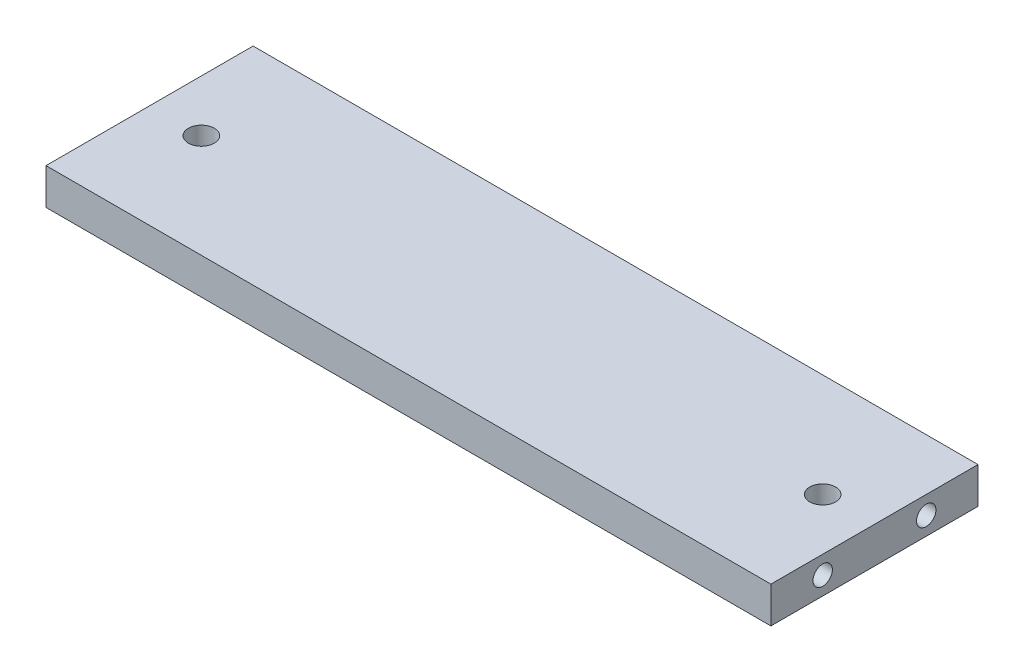
ISO-10303-21;
HEADER;
FILE_DESCRIPTION(('STEP AP214'),'2;1');
FILE_NAME('part.step','',(''),(''),'','','');
FILE_SCHEMA(('AUTOMOTIVE_DESIGN { 1 0 10303 214 1 1 1 1 }'));
ENDSEC;
DATA;
#1=APPLICATION_CONTEXT('core data for automotive mechanical design processes');
#2=APPLICATION_PROTOCOL_DEFINITION('international standard','automotive_design',2000,#1);
#3=PRODUCT_CONTEXT('',#1,'mechanical');
#4=PRODUCT('Part','Part','',(#3));
#5=PRODUCT_RELATED_PRODUCT_CATEGORY('part','',(#4));
#6=PRODUCT_DEFINITION_FORMATION('','',#4);
#7=PRODUCT_DEFINITION_CONTEXT('part definition',#1,'design');
#8=PRODUCT_DEFINITION('design','',#6,#7);
#9=PRODUCT_DEFINITION_SHAPE('','',#8);
#10=(LENGTH_UNIT() NAMED_UNIT(*) SI_UNIT(.MILLI.,.METRE.));
#11=(NAMED_UNIT(*) PLANE_ANGLE_UNIT() SI_UNIT($,.RADIAN.));
#12=(NAMED_UNIT(*) SI_UNIT($,.STERADIAN.) SOLID_ANGLE_UNIT());
#13=UNCERTAINTY_MEASURE_WITH_UNIT(LENGTH_MEASURE(1.E-05),#10,'distance_accuracy_value','');
#14=(GEOMETRIC_REPRESENTATION_CONTEXT(3) GLOBAL_UNCERTAINTY_ASSIGNED_CONTEXT((#13)) GLOBAL_UNIT_ASSIGNED_CONTEXT((#10,
#11,#12)) REPRESENTATION_CONTEXT('',''));
#15=CARTESIAN_POINT('',(0.,0.,0.));
#16=DIRECTION('',(0.,0.,1.));
#17=DIRECTION('',(1.,0.,0.));
#18=AXIS2_PLACEMENT_3D('',#15,#16,#17);
#19=CARTESIAN_POINT('',(0.,4.445,0.));
#20=DIRECTION('',(1.,0.,0.));
#21=DIRECTION('',(0.,0.,-1.));
#22=AXIS2_PLACEMENT_3D('',#19,#20,#21);
#23=PLANE('',#22);
#24=DIRECTION('',(0.,0.,1.));
#25=VECTOR('',#24,1.);
#26=CARTESIAN_POINT('',(0.,0.,0.));
#27=LINE('',#26,#25);
#28=CARTESIAN_POINT('',(0.,0.,-25.4));
#29=VERTEX_POINT('',#28);
#30=CARTESIAN_POINT('',(0.,0.,0.));
#31=VERTEX_POINT('',#30);
#32=EDGE_CURVE('E96',#29,#31,#27,.T.);
#33=ORIENTED_EDGE('',*,*,#32,.T.);
#34=DIRECTION('',(0.,-1.,0.));
#35=VECTOR('',#34,1.);
#36=CARTESIAN_POINT('',(0.,4.445,0.));
#37=LINE('',#36,#35);
#38=CARTESIAN_POINT('',(0.,4.445,0.));
#39=VERTEX_POINT('',#38);
#40=EDGE_CURVE('E11',#39,#31,#37,.T.);
#41=ORIENTED_EDGE('',*,*,#40,.F.);
#42=DIRECTION('',(0.,0.,1.));
#43=VECTOR('',#42,1.);
#44=CARTESIAN_POINT('',(0.,4.445,0.));
#45=LINE('',#44,#43);
#46=CARTESIAN_POINT('',(0.,4.445,-25.4));
#47=VERTEX_POINT('',#46);
#48=EDGE_CURVE('E84',#47,#39,#45,.T.);
#49=ORIENTED_EDGE('',*,*,#48,.F.);
#50=DIRECTION('',(0.,-1.,0.));
#51=VECTOR('',#50,1.);
#52=CARTESIAN_POINT('',(0.,4.445,-25.4));
#53=LINE('',#52,#51);
#54=EDGE_CURVE('E92',#47,#29,#53,.T.);
#55=ORIENTED_EDGE('',*,*,#54,.T.);
#56=EDGE_LOOP('',(#33,#41,#49,#55));
#57=FACE_BOUND('',#56,.T.);
#58=ADVANCED_FACE('F33',(#57),#23,.F.);
#59=CARTESIAN_POINT('',(0.,4.445,0.));
#60=DIRECTION('',(0.,0.,-1.));
#61=DIRECTION('',(-1.,0.,0.));
#62=AXIS2_PLACEMENT_3D('',#59,#60,#61);
#63=PLANE('',#62);
#64=DIRECTION('',(1.,0.,0.));
#65=VECTOR('',#64,1.);
#66=CARTESIAN_POINT('',(0.,0.,0.));
#67=LINE('',#66,#65);
#68=CARTESIAN_POINT('',(88.9,0.,0.));
#69=VERTEX_POINT('',#68);
#70=EDGE_CURVE('E88',#31,#69,#67,.T.);
#71=ORIENTED_EDGE('',*,*,#70,.T.);
#72=DIRECTION('',(0.,-1.,0.));
#73=VECTOR('',#72,1.);
#74=CARTESIAN_POINT('',(88.9,4.445,0.));
#75=LINE('',#74,#73);
#76=CARTESIAN_POINT('',(88.9,4.445,0.));
#77=VERTEX_POINT('',#76);
#78=EDGE_CURVE('E41',#77,#69,#75,.T.);
#79=ORIENTED_EDGE('',*,*,#78,.F.);
#80=DIRECTION('',(1.,0.,0.));
#81=VECTOR('',#80,1.);
#82=CARTESIAN_POINT('',(0.,4.445,0.));
#83=LINE('',#82,#81);
#84=EDGE_CURVE('E79',#39,#77,#83,.T.);
#85=ORIENTED_EDGE('',*,*,#84,.F.);
#86=ORIENTED_EDGE('',*,*,#40,.T.);
#87=EDGE_LOOP('',(#71,#79,#85,#86));
#88=FACE_BOUND('',#87,.T.);
#89=ADVANCED_FACE('F87',(#88),#63,.F.);
#90=CARTESIAN_POINT('',(88.9,4.445,0.));
#91=DIRECTION('',(-1.,0.,0.));
#92=DIRECTION('',(0.,0.,1.));
#93=AXIS2_PLACEMENT_3D('',#90,#91,#92);
#94=PLANE('',#93);
#95=CARTESIAN_POINT('',(88.9,2.2225,-6.35));
#96=DIRECTION('',(1.,0.,0.));
#97=DIRECTION('',(0.,0.,1.));
#98=AXIS2_PLACEMENT_3D('',#95,#96,#97);
#99=CIRCLE('',#98,1.190625);
#100=CARTESIAN_POINT('',(88.9,2.2225,-7.540625));
#101=VERTEX_POINT('',#100);
#102=EDGE_CURVE('E116',#101,#101,#99,.T.);
#103=ORIENTED_EDGE('',*,*,#102,.F.);
#104=EDGE_LOOP('',(#103));
#105=FACE_BOUND('',#104,.T.);
#106=CARTESIAN_POINT('',(88.9,2.2225,-19.05));
#107=DIRECTION('',(1.,0.,0.));
#108=DIRECTION('',(0.,0.,-1.));
#109=AXIS2_PLACEMENT_3D('',#106,#107,#108);
#110=CIRCLE('',#109,1.190625);
#111=CARTESIAN_POINT('',(88.9,2.2225,-20.240625));
#112=VERTEX_POINT('',#111);
#113=EDGE_CURVE('E110',#112,#112,#110,.T.);
#114=ORIENTED_EDGE('',*,*,#113,.F.);
#115=EDGE_LOOP('',(#114));
#116=FACE_BOUND('',#115,.T.);
#117=DIRECTION('',(0.,0.,-1.));
#118=VECTOR('',#117,1.);
#119=CARTESIAN_POINT('',(88.9,0.,0.));
#120=LINE('',#119,#118);
#121=CARTESIAN_POINT('',(88.9,0.,-25.4));
#122=VERTEX_POINT('',#121);
#123=EDGE_CURVE('E66',#69,#122,#120,.T.);
#124=ORIENTED_EDGE('',*,*,#123,.T.);
#125=DIRECTION('',(0.,-1.,0.));
#126=VECTOR('',#125,1.);
#127=CARTESIAN_POINT('',(88.9,4.445,-25.4));
#128=LINE('',#127,#126);
#129=CARTESIAN_POINT('',(88.9,4.445,-25.4));
#130=VERTEX_POINT('',#129);
#131=EDGE_CURVE('E89',#130,#122,#128,.T.);
#132=ORIENTED_EDGE('',*,*,#131,.F.);
#133=DIRECTION('',(0.,0.,-1.));
#134=VECTOR('',#133,1.);
#135=CARTESIAN_POINT('',(88.9,4.445,0.));
#136=LINE('',#135,#134);
#137=EDGE_CURVE('E82',#77,#130,#136,.T.);
#138=ORIENTED_EDGE('',*,*,#137,.F.);
#139=ORIENTED_EDGE('',*,*,#78,.T.);
#140=EDGE_LOOP('',(#124,#132,#138,#139));
#141=FACE_BOUND('',#140,.T.);
#142=ADVANCED_FACE('F90',(#105,#116,#141),#94,.F.);
#143=CARTESIAN_POINT('',(0.,4.445,-25.4));
#144=DIRECTION('',(0.,0.,1.));
#145=DIRECTION('',(1.,0.,0.));
#146=AXIS2_PLACEMENT_3D('',#143,#144,#145);
#147=PLANE('',#146);
#148=DIRECTION('',(-1.,0.,0.));
#149=VECTOR('',#148,1.);
#150=CARTESIAN_POINT('',(0.,0.,-25.4));
#151=LINE('',#150,#149);
#152=EDGE_CURVE('E72',#122,#29,#151,.T.);
#153=ORIENTED_EDGE('',*,*,#152,.T.);
#154=ORIENTED_EDGE('',*,*,#54,.F.);
#155=DIRECTION('',(-1.,0.,0.));
#156=VECTOR('',#155,1.);
#157=CARTESIAN_POINT('',(0.,4.445,-25.4));
#158=LINE('',#157,#156);
#159=EDGE_CURVE('E49',#130,#47,#158,.T.);
#160=ORIENTED_EDGE('',*,*,#159,.F.);
#161=ORIENTED_EDGE('',*,*,#131,.T.);
#162=EDGE_LOOP('',(#153,#154,#160,#161));
#163=FACE_BOUND('',#162,.T.);
#164=ADVANCED_FACE('F104',(#163),#147,.F.);
#165=CARTESIAN_POINT('',(0.,4.445,0.));
#166=DIRECTION('',(0.,-1.,0.));
#167=DIRECTION('',(0.,0.,-1.));
#168=AXIS2_PLACEMENT_3D('',#165,#166,#167);
#169=PLANE('',#168);
#170=CARTESIAN_POINT('',(82.55,4.445,-12.7));
#171=DIRECTION('',(0.,1.,0.));
#172=DIRECTION('',(0.,0.,1.));
#173=AXIS2_PLACEMENT_3D('',#170,#171,#172);
#174=CIRCLE('',#173,1.5875);
#175=CARTESIAN_POINT('',(82.55,4.445,-11.1125));
#176=VERTEX_POINT('',#175);
#177=EDGE_CURVE('E128',#176,#176,#174,.T.);
#178=ORIENTED_EDGE('',*,*,#177,.F.);
#179=EDGE_LOOP('',(#178));
#180=FACE_BOUND('',#179,.T.);
#181=CARTESIAN_POINT('',(6.35,4.445,-12.7));
#182=DIRECTION('',(0.,1.,0.));
#183=DIRECTION('',(0.,0.,1.));
#184=AXIS2_PLACEMENT_3D('',#181,#182,#183);
#185=CIRCLE('',#184,1.5875);
#186=CARTESIAN_POINT('',(6.35,4.445,-11.1125));
#187=VERTEX_POINT('',#186);
#188=EDGE_CURVE('E122',#187,#187,#185,.T.);
#189=ORIENTED_EDGE('',*,*,#188,.F.);
#190=EDGE_LOOP('',(#189));
#191=FACE_BOUND('',#190,.T.);
#192=ORIENTED_EDGE('',*,*,#48,.T.);
#193=ORIENTED_EDGE('',*,*,#84,.T.);
#194=ORIENTED_EDGE('',*,*,#137,.T.);
#195=ORIENTED_EDGE('',*,*,#159,.T.);
#196=EDGE_LOOP('',(#192,#193,#194,#195));
#197=FACE_BOUND('',#196,.T.);
#198=ADVANCED_FACE('F80',(#180,#191,#197),#169,.F.);
#199=CARTESIAN_POINT('',(0.,0.,0.));
#200=DIRECTION('',(0.,-1.,0.));
#201=DIRECTION('',(0.,0.,-1.));
#202=AXIS2_PLACEMENT_3D('',#199,#200,#201);
#203=PLANE('',#202);
#204=CARTESIAN_POINT('',(82.55,0.,-12.7));
#205=DIRECTION('',(0.,1.,0.));
#206=DIRECTION('',(0.,0.,1.));
#207=AXIS2_PLACEMENT_3D('',#204,#205,#206);
#208=CIRCLE('',#207,1.5875);
#209=CARTESIAN_POINT('',(82.55,0.,-11.1125));
#210=VERTEX_POINT('',#209);
#211=EDGE_CURVE('E125',#210,#210,#208,.T.);
#212=ORIENTED_EDGE('',*,*,#211,.T.);
#213=EDGE_LOOP('',(#212));
#214=FACE_BOUND('',#213,.T.);
#215=CARTESIAN_POINT('',(6.35,0.,-12.7));
#216=DIRECTION('',(0.,1.,0.));
#217=DIRECTION('',(0.,0.,1.));
#218=AXIS2_PLACEMENT_3D('',#215,#216,#217);
#219=CIRCLE('',#218,1.5875);
#220=CARTESIAN_POINT('',(6.35,0.,-11.1125));
#221=VERTEX_POINT('',#220);
#222=EDGE_CURVE('E119',#221,#221,#219,.T.);
#223=ORIENTED_EDGE('',*,*,#222,.T.);
#224=EDGE_LOOP('',(#223));
#225=FACE_BOUND('',#224,.T.);
#226=ORIENTED_EDGE('',*,*,#32,.F.);
#227=ORIENTED_EDGE('',*,*,#152,.F.);
#228=ORIENTED_EDGE('',*,*,#123,.F.);
#229=ORIENTED_EDGE('',*,*,#70,.F.);
#230=EDGE_LOOP('',(#226,#227,#228,#229));
#231=FACE_BOUND('',#230,.T.);
#232=ADVANCED_FACE('F107',(#214,#225,#231),#203,.T.);
#233=CARTESIAN_POINT('',(79.375,2.2225,-19.05));
#234=DIRECTION('',(1.,0.,0.));
#235=DIRECTION('',(0.,0.,-1.));
#236=AXIS2_PLACEMENT_3D('',#233,#234,#235);
#237=CYLINDRICAL_SURFACE('',#236,1.190625);
#238=CARTESIAN_POINT('',(79.375,2.2225,-19.05));
#239=DIRECTION('',(1.,0.,0.));
#240=DIRECTION('',(0.,0.,-1.));
#241=AXIS2_PLACEMENT_3D('',#238,#239,#240);
#242=CIRCLE('',#241,1.190625);
#243=CARTESIAN_POINT('',(79.375,2.2225,-20.240625));
#244=VERTEX_POINT('',#243);
#245=EDGE_CURVE('E99',#244,#244,#242,.T.);
#246=CARTESIAN_POINT('',(79.375,2.2225,-20.240625));
#247=CARTESIAN_POINT('',(79.47421875,2.2225,-20.240625));
#248=CARTESIAN_POINT('',(79.5734375,2.2225,-20.240625));
#249=CARTESIAN_POINT('',(79.771875,2.2225,-20.240625));
#250=CARTESIAN_POINT('',(79.87109375,2.2225,-20.240625));
#251=CARTESIAN_POINT('',(80.06953125,2.2225,-20.240625));
#252=CARTESIAN_POINT('',(80.16875,2.2225,-20.240625));
#253=CARTESIAN_POINT('',(80.3671875,2.2225,-20.240625));
#254=CARTESIAN_POINT('',(80.46640625,2.2225,-20.240625));
#255=CARTESIAN_POINT('',(80.66484375,2.2225,-20.240625));
#256=CARTESIAN_POINT('',(80.7640625,2.2225,-20.240625));
#257=CARTESIAN_POINT('',(80.9625,2.2225,-20.240625));
#258=CARTESIAN_POINT('',(81.06171875,2.2225,-20.240625));
#259=CARTESIAN_POINT('',(81.26015625,2.2225,-20.240625));
#260=CARTESIAN_POINT('',(81.359375,2.2225,-20.240625));
#261=CARTESIAN_POINT('',(81.5578125,2.2225,-20.240625));
#262=CARTESIAN_POINT('',(81.65703125,2.2225,-20.240625));
#263=CARTESIAN_POINT('',(81.85546875,2.2225,-20.240625));
#264=CARTESIAN_POINT('',(81.9546875,2.2225,-20.240625));
#265=CARTESIAN_POINT('',(82.153125,2.2225,-20.240625));
#266=CARTESIAN_POINT('',(82.25234375,2.2225,-20.240625));
#267=CARTESIAN_POINT('',(82.45078125,2.2225,-20.240625));
#268=CARTESIAN_POINT('',(82.55,2.2225,-20.240625));
#269=CARTESIAN_POINT('',(82.7484375,2.2225,-20.240625));
#270=CARTESIAN_POINT('',(82.84765625,2.2225,-20.240625));
#271=CARTESIAN_POINT('',(83.04609375,2.2225,-20.240625));
#272=CARTESIAN_POINT('',(83.1453125,2.2225,-20.240625));
#273=CARTESIAN_POINT('',(83.34375,2.2225,-20.240625));
#274=CARTESIAN_POINT('',(83.44296875,2.2225,-20.240625));
#275=CARTESIAN_POINT('',(83.64140625,2.2225,-20.240625));
#276=CARTESIAN_POINT('',(83.740625,2.2225,-20.240625));
#277=CARTESIAN_POINT('',(83.9390625,2.2225,-20.240625));
#278=CARTESIAN_POINT('',(84.03828125,2.2225,-20.240625));
#279=CARTESIAN_POINT('',(84.23671875,2.2225,-20.240625));
#280=CARTESIAN_POINT('',(84.3359375,2.2225,-20.240625));
#281=CARTESIAN_POINT('',(84.534375,2.2225,-20.240625));
#282=CARTESIAN_POINT('',(84.63359375,2.2225,-20.240625));
#283=CARTESIAN_POINT('',(84.83203125,2.2225,-20.240625));
#284=CARTESIAN_POINT('',(84.93125,2.2225,-20.240625));
#285=CARTESIAN_POINT('',(85.1296875,2.2225,-20.240625));
#286=CARTESIAN_POINT('',(85.22890625,2.2225,-20.240625));
#287=CARTESIAN_POINT('',(85.42734375,2.2225,-20.240625));
#288=CARTESIAN_POINT('',(85.5265625,2.2225,-20.240625));
#289=CARTESIAN_POINT('',(85.725,2.2225,-20.240625));
#290=CARTESIAN_POINT('',(85.82421875,2.2225,-20.240625));
#291=CARTESIAN_POINT('',(86.02265625,2.2225,-20.240625));
#292=CARTESIAN_POINT('',(86.121875,2.2225,-20.240625));
#293=CARTESIAN_POINT('',(86.3203125,2.2225,-20.240625));
#294=CARTESIAN_POINT('',(86.41953125,2.2225,-20.240625));
#295=CARTESIAN_POINT('',(86.61796875,2.2225,-20.240625));
#296=CARTESIAN_POINT('',(86.7171875,2.2225,-20.240625));
#297=CARTESIAN_POINT('',(86.915625,2.2225,-20.240625));
#298=CARTESIAN_POINT('',(87.01484375,2.2225,-20.240625));
#299=CARTESIAN_POINT('',(87.21328125,2.2225,-20.240625));
#300=CARTESIAN_POINT('',(87.3125,2.2225,-20.240625));
#301=CARTESIAN_POINT('',(87.5109375,2.2225,-20.240625));
#302=CARTESIAN_POINT('',(87.61015625,2.2225,-20.240625));
#303=CARTESIAN_POINT('',(87.80859375,2.2225,-20.240625));
#304=CARTESIAN_POINT('',(87.9078125,2.2225,-20.240625));
#305=CARTESIAN_POINT('',(88.10625,2.2225,-20.240625));
#306=CARTESIAN_POINT('',(88.20546875,2.2225,-20.240625));
#307=CARTESIAN_POINT('',(88.40390625,2.2225,-20.240625));
#308=CARTESIAN_POINT('',(88.503125,2.2225,-20.240625));
#309=CARTESIAN_POINT('',(88.7015625,2.2225,-20.240625));
#310=CARTESIAN_POINT('',(88.80078125,2.2225,-20.240625));
#311=CARTESIAN_POINT('',(88.9,2.2225,-20.240625));
#312=B_SPLINE_CURVE_WITH_KNOTS('',3,(#246,#247,#248,#249,#250,#251,#252,#253,#254,#255,#256,
#257,#258,#259,#260,#261,#262,#263,#264,#265,#266,#267,#268,#269,#270,#271,#272,#273,#274,#275,
#276,#277,#278,#279,#280,#281,#282,#283,#284,#285,#286,#287,#288,#289,#290,#291,#292,#293,#294,
#295,#296,#297,#298,#299,#300,#301,#302,#303,#304,#305,#306,#307,#308,#309,#310,#311),
.UNSPECIFIED.,.F.,.F.,(4,2,2,2,2,2,2,2,2,2,2,2,2,2,2,2,2,2,2,2,2,2,2,2,2,2,2,2,2,2,2,2,4),(0.,
0.29765625,0.5953125,0.892968750000001,1.190625,1.48828125,1.7859375,2.08359375,2.38125,
2.67890625,2.9765625,3.27421875,3.571875,3.86953125,4.1671875,4.46484375,4.7625,5.06015625,
5.3578125,5.65546875,5.953125,6.25078125,6.5484375,6.84609375,7.14375,7.44140625,7.7390625,
8.03671875000001,8.334375,8.63203125,8.92968750000001,9.22734375000001,9.52500000000001),.UNSPECIFIED.);
#313=EDGE_CURVE('BSEAM172',#244,#112,#312,.T.);
#314=ORIENTED_EDGE('',*,*,#245,.F.);
#315=ORIENTED_EDGE('',*,*,#113,.T.);
#316=ORIENTED_EDGE('',*,*,#313,.T.);
#317=ORIENTED_EDGE('',*,*,#313,.F.);
#318=EDGE_LOOP('',(#314,#316,#315,#317));
#319=FACE_BOUND('',#318,.T.);
#320=ADVANCED_FACE('F172',(#319),#237,.F.);
#321=CARTESIAN_POINT('',(79.375,2.2225,-19.05));
#322=DIRECTION('',(1.,0.,0.));
#323=DIRECTION('',(0.,0.,-1.));
#324=AXIS2_PLACEMENT_3D('',#321,#322,#323);
#325=PLANE('',#324);
#326=ORIENTED_EDGE('',*,*,#245,.T.);
#327=EDGE_LOOP('',(#326));
#328=FACE_BOUND('',#327,.T.);
#329=ADVANCED_FACE('F176',(#328),#325,.T.);
#330=CARTESIAN_POINT('',(79.375,2.2225,-6.35));
#331=DIRECTION('',(1.,0.,0.));
#332=DIRECTION('',(0.,0.,-1.));
#333=AXIS2_PLACEMENT_3D('',#330,#331,#332);
#334=CYLINDRICAL_SURFACE('',#333,1.190625);
#335=CARTESIAN_POINT('',(79.375,2.2225,-6.35));
#336=DIRECTION('',(1.,0.,0.));
#337=DIRECTION('',(0.,0.,1.));
#338=AXIS2_PLACEMENT_3D('',#335,#336,#337);
#339=CIRCLE('',#338,1.190625);
#340=CARTESIAN_POINT('',(79.375,2.2225,-7.540625));
#341=VERTEX_POINT('',#340);
#342=EDGE_CURVE('E113',#341,#341,#339,.T.);
#343=CARTESIAN_POINT('',(79.375,2.2225,-7.540625));
#344=CARTESIAN_POINT('',(79.47421875,2.2225,-7.540625));
#345=CARTESIAN_POINT('',(79.5734375,2.2225,-7.540625));
#346=CARTESIAN_POINT('',(79.771875,2.2225,-7.540625));
#347=CARTESIAN_POINT('',(79.87109375,2.2225,-7.540625));
#348=CARTESIAN_POINT('',(80.06953125,2.2225,-7.540625));
#349=CARTESIAN_POINT('',(80.16875,2.2225,-7.540625));
#350=CARTESIAN_POINT('',(80.3671875,2.2225,-7.540625));
#351=CARTESIAN_POINT('',(80.46640625,2.2225,-7.540625));
#352=CARTESIAN_POINT('',(80.66484375,2.2225,-7.540625));
#353=CARTESIAN_POINT('',(80.7640625,2.2225,-7.540625));
#354=CARTESIAN_POINT('',(80.9625,2.2225,-7.540625));
#355=CARTESIAN_POINT('',(81.06171875,2.2225,-7.540625));
#356=CARTESIAN_POINT('',(81.26015625,2.2225,-7.540625));
#357=CARTESIAN_POINT('',(81.359375,2.2225,-7.540625));
#358=CARTESIAN_POINT('',(81.5578125,2.2225,-7.540625));
#359=CARTESIAN_POINT('',(81.65703125,2.2225,-7.540625));
#360=CARTESIAN_POINT('',(81.85546875,2.2225,-7.540625));
#361=CARTESIAN_POINT('',(81.9546875,2.2225,-7.540625));
#362=CARTESIAN_POINT('',(82.153125,2.2225,-7.540625));
#363=CARTESIAN_POINT('',(82.25234375,2.2225,-7.540625));
#364=CARTESIAN_POINT('',(82.45078125,2.2225,-7.540625));
#365=CARTESIAN_POINT('',(82.55,2.2225,-7.540625));
#366=CARTESIAN_POINT('',(82.7484375,2.2225,-7.540625));
#367=CARTESIAN_POINT('',(82.84765625,2.2225,-7.540625));
#368=CARTESIAN_POINT('',(83.04609375,2.2225,-7.540625));
#369=CARTESIAN_POINT('',(83.1453125,2.2225,-7.540625));
#370=CARTESIAN_POINT('',(83.34375,2.2225,-7.540625));
#371=CARTESIAN_POINT('',(83.44296875,2.2225,-7.540625));
#372=CARTESIAN_POINT('',(83.64140625,2.2225,-7.540625));
#373=CARTESIAN_POINT('',(83.740625,2.2225,-7.540625));
#374=CARTESIAN_POINT('',(83.9390625,2.2225,-7.540625));
#375=CARTESIAN_POINT('',(84.03828125,2.2225,-7.540625));
#376=CARTESIAN_POINT('',(84.23671875,2.2225,-7.540625));
#377=CARTESIAN_POINT('',(84.3359375,2.2225,-7.540625));
#378=CARTESIAN_POINT('',(84.534375,2.2225,-7.540625));
#379=CARTESIAN_POINT('',(84.63359375,2.2225,-7.540625));
#380=CARTESIAN_POINT('',(84.83203125,2.2225,-7.540625));
#381=CARTESIAN_POINT('',(84.93125,2.2225,-7.540625));
#382=CARTESIAN_POINT('',(85.1296875,2.2225,-7.540625));
#383=CARTESIAN_POINT('',(85.22890625,2.2225,-7.540625));
#384=CARTESIAN_POINT('',(85.42734375,2.2225,-7.540625));
#385=CARTESIAN_POINT('',(85.5265625,2.2225,-7.540625));
#386=CARTESIAN_POINT('',(85.725,2.2225,-7.540625));
#387=CARTESIAN_POINT('',(85.82421875,2.2225,-7.540625));
#388=CARTESIAN_POINT('',(86.02265625,2.2225,-7.540625));
#389=CARTESIAN_POINT('',(86.121875,2.2225,-7.540625));
#390=CARTESIAN_POINT('',(86.3203125,2.2225,-7.540625));
#391=CARTESIAN_POINT('',(86.41953125,2.2225,-7.540625));
#392=CARTESIAN_POINT('',(86.61796875,2.2225,-7.540625));
#393=CARTESIAN_POINT('',(86.7171875,2.2225,-7.540625));
#394=CARTESIAN_POINT('',(86.915625,2.2225,-7.540625));
#395=CARTESIAN_POINT('',(87.01484375,2.2225,-7.540625));
#396=CARTESIAN_POINT('',(87.21328125,2.2225,-7.540625));
#397=CARTESIAN_POINT('',(87.3125,2.2225,-7.540625));
#398=CARTESIAN_POINT('',(87.5109375,2.2225,-7.540625));
#399=CARTESIAN_POINT('',(87.61015625,2.2225,-7.540625));
#400=CARTESIAN_POINT('',(87.80859375,2.2225,-7.540625));
#401=CARTESIAN_POINT('',(87.9078125,2.2225,-7.540625));
#402=CARTESIAN_POINT('',(88.10625,2.2225,-7.540625));
#403=CARTESIAN_POINT('',(88.20546875,2.2225,-7.540625));
#404=CARTESIAN_POINT('',(88.40390625,2.2225,-7.540625));
#405=CARTESIAN_POINT('',(88.503125,2.2225,-7.540625));
#406=CARTESIAN_POINT('',(88.7015625,2.2225,-7.540625));
#407=CARTESIAN_POINT('',(88.80078125,2.2225,-7.540625));
#408=CARTESIAN_POINT('',(88.9,2.2225,-7.540625));
#409=B_SPLINE_CURVE_WITH_KNOTS('',3,(#343,#344,#345,#346,#347,#348,#349,#350,#351,#352,#353,
#354,#355,#356,#357,#358,#359,#360,#361,#362,#363,#364,#365,#366,#367,#368,#369,#370,#371,#372,
#373,#374,#375,#376,#377,#378,#379,#380,#381,#382,#383,#384,#385,#386,#387,#388,#389,#390,#391,
#392,#393,#394,#395,#396,#397,#398,#399,#400,#401,#402,#403,#404,#405,#406,#407,#408),
.UNSPECIFIED.,.F.,.F.,(4,2,2,2,2,2,2,2,2,2,2,2,2,2,2,2,2,2,2,2,2,2,2,2,2,2,2,2,2,2,2,2,4),(0.,
0.29765625,0.5953125,0.892968750000001,1.190625,1.48828125,1.7859375,2.08359375,2.38125,
2.67890625,2.9765625,3.27421875,3.571875,3.86953125,4.1671875,4.46484375,4.7625,5.06015625,
5.3578125,5.65546875,5.953125,6.25078125,6.5484375,6.84609375,7.14375,7.44140625,7.7390625,
8.03671875000001,8.334375,8.63203125,8.92968750000001,9.22734375000001,9.52500000000001),.UNSPECIFIED.);
#410=EDGE_CURVE('BSEAM155',#341,#101,#409,.T.);
#411=ORIENTED_EDGE('',*,*,#342,.F.);
#412=ORIENTED_EDGE('',*,*,#102,.T.);
#413=ORIENTED_EDGE('',*,*,#410,.T.);
#414=ORIENTED_EDGE('',*,*,#410,.F.);
#415=EDGE_LOOP('',(#411,#413,#412,#414));
#416=FACE_BOUND('',#415,.T.);
#417=ADVANCED_FACE('F155',(#416),#334,.F.);
#418=CARTESIAN_POINT('',(79.375,2.2225,-6.35));
#419=DIRECTION('',(-1.,0.,0.));
#420=DIRECTION('',(0.,0.,1.));
#421=AXIS2_PLACEMENT_3D('',#418,#419,#420);
#422=PLANE('',#421);
#423=ORIENTED_EDGE('',*,*,#342,.T.);
#424=EDGE_LOOP('',(#423));
#425=FACE_BOUND('',#424,.T.);
#426=ADVANCED_FACE('F149',(#425),#422,.F.);
#427=CARTESIAN_POINT('',(6.35,0.,-12.7));
#428=DIRECTION('',(0.,1.,0.));
#429=DIRECTION('',(0.,0.,1.));
#430=AXIS2_PLACEMENT_3D('',#427,#428,#429);
#431=CYLINDRICAL_SURFACE('',#430,1.5875);
#432=ORIENTED_EDGE('',*,*,#222,.F.);
#433=EDGE_LOOP('',(#432));
#434=FACE_BOUND('',#433,.T.);
#435=ORIENTED_EDGE('',*,*,#188,.T.);
#436=EDGE_LOOP('',(#435));
#437=FACE_BOUND('',#436,.T.);
#438=ADVANCED_FACE('F139',(#434,#437),#431,.F.);
#439=CARTESIAN_POINT('',(82.55,0.,-12.7));
#440=DIRECTION('',(0.,1.,0.));
#441=DIRECTION('',(0.,0.,1.));
#442=AXIS2_PLACEMENT_3D('',#439,#440,#441);
#443=CYLINDRICAL_SURFACE('',#442,1.5875);
#444=ORIENTED_EDGE('',*,*,#211,.F.);
#445=EDGE_LOOP('',(#444));
#446=FACE_BOUND('',#445,.T.);
#447=ORIENTED_EDGE('',*,*,#177,.T.);
#448=EDGE_LOOP('',(#447));
#449=FACE_BOUND('',#448,.T.);
#450=ADVANCED_FACE('F136',(#446,#449),#443,.F.);
#451=CLOSED_SHELL('',(#58,#89,#142,#164,#198,#232,#320,#329,#417,#426,#438,#450));
#452=MANIFOLD_SOLID_BREP('B2',#451);
#453=ADVANCED_BREP_SHAPE_REPRESENTATION('',(#18,#452),#14);
#454=SHAPE_DEFINITION_REPRESENTATION(#9,#453);
ENDSEC;
END-ISO-10303-21;
